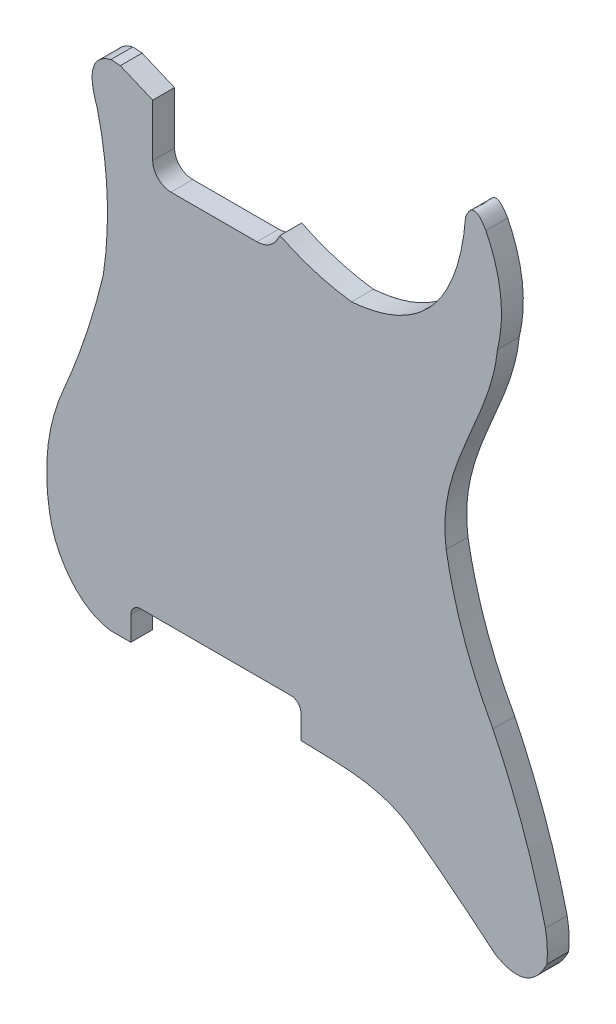
ISO-10303-21;
HEADER;
FILE_DESCRIPTION(('STEP AP214'),'2;1');
FILE_NAME('part.step','',(''),(''),'','','');
FILE_SCHEMA(('AUTOMOTIVE_DESIGN { 1 0 10303 214 1 1 1 1 }'));
ENDSEC;
DATA;
#1=APPLICATION_CONTEXT('core data for automotive mechanical design processes');
#2=APPLICATION_PROTOCOL_DEFINITION('international standard','automotive_design',2000,#1);
#3=PRODUCT_CONTEXT('',#1,'mechanical');
#4=PRODUCT('Part','Part','',(#3));
#5=PRODUCT_RELATED_PRODUCT_CATEGORY('part','',(#4));
#6=PRODUCT_DEFINITION_FORMATION('','',#4);
#7=PRODUCT_DEFINITION_CONTEXT('part definition',#1,'design');
#8=PRODUCT_DEFINITION('design','',#6,#7);
#9=PRODUCT_DEFINITION_SHAPE('','',#8);
#10=(LENGTH_UNIT() NAMED_UNIT(*) SI_UNIT(.MILLI.,.METRE.));
#11=(NAMED_UNIT(*) PLANE_ANGLE_UNIT() SI_UNIT($,.RADIAN.));
#12=(NAMED_UNIT(*) SI_UNIT($,.STERADIAN.) SOLID_ANGLE_UNIT());
#13=UNCERTAINTY_MEASURE_WITH_UNIT(LENGTH_MEASURE(1.E-05),#10,'distance_accuracy_value','');
#14=(GEOMETRIC_REPRESENTATION_CONTEXT(3) GLOBAL_UNCERTAINTY_ASSIGNED_CONTEXT((#13)) GLOBAL_UNIT_ASSIGNED_CONTEXT((#10,
#11,#12)) REPRESENTATION_CONTEXT('',''));
#15=CARTESIAN_POINT('',(0.,0.,0.));
#16=DIRECTION('',(0.,0.,1.));
#17=DIRECTION('',(1.,0.,0.));
#18=AXIS2_PLACEMENT_3D('',#15,#16,#17);
#19=CARTESIAN_POINT('',(147.862901342969,240.419802610291,10.));
#20=CARTESIAN_POINT('',(130.641476408565,242.603233813043,10.));
#21=CARTESIAN_POINT('',(115.04607442808,250.35951460855,10.));
#22=B_SPLINE_CURVE_WITH_KNOTS('',2,(#19,#20,#21),.UNSPECIFIED.,.F.,.F.,(3,3),(0.,1.),.UNSPECIFIED.);
#23=DIRECTION('',(0.,0.,-1.));
#24=VECTOR('',#23,1.);
#25=SURFACE_OF_LINEAR_EXTRUSION('',#22,#24);
#26=CARTESIAN_POINT('',(147.862901342969,240.419802610291,0.));
#27=CARTESIAN_POINT('',(130.641476408565,242.603233813043,0.));
#28=CARTESIAN_POINT('',(115.04607442808,250.35951460855,0.));
#29=B_SPLINE_CURVE_WITH_KNOTS('',2,(#26,#27,#28),.UNSPECIFIED.,.F.,.F.,(3,3),(0.,1.),.UNSPECIFIED.);
#30=CARTESIAN_POINT('',(147.862901342969,240.419802610291,0.));
#31=VERTEX_POINT('',#30);
#32=CARTESIAN_POINT('',(115.04607442808,250.35951460855,0.));
#33=VERTEX_POINT('',#32);
#34=EDGE_CURVE('E535',#31,#33,#29,.T.);
#35=ORIENTED_EDGE('',*,*,#34,.T.);
#36=DIRECTION('',(0.,0.,-1.));
#37=VECTOR('',#36,1.);
#38=CARTESIAN_POINT('',(115.04607442808,250.35951460855,10.));
#39=LINE('',#38,#37);
#40=CARTESIAN_POINT('',(115.04607442808,250.35951460855,10.));
#41=VERTEX_POINT('',#40);
#42=EDGE_CURVE('E11',#41,#33,#39,.T.);
#43=ORIENTED_EDGE('',*,*,#42,.F.);
#44=CARTESIAN_POINT('',(147.862901342969,240.419802610291,10.));
#45=VERTEX_POINT('',#44);
#46=EDGE_CURVE('E660',#45,#41,#22,.T.);
#47=ORIENTED_EDGE('',*,*,#46,.F.);
#48=DIRECTION('',(0.,0.,-1.));
#49=VECTOR('',#48,1.);
#50=CARTESIAN_POINT('',(147.862901342969,240.419802610291,10.));
#51=LINE('',#50,#49);
#52=EDGE_CURVE('E254',#45,#31,#51,.T.);
#53=ORIENTED_EDGE('',*,*,#52,.T.);
#54=EDGE_LOOP('',(#35,#43,#47,#53));
#55=FACE_BOUND('',#54,.T.);
#56=ADVANCED_FACE('F35',(#55),#25,.F.);
#57=CARTESIAN_POINT('',(115.04607442808,250.35951460855,10.));
#58=DIRECTION('',(0.875028133715148,-0.484072066129606,0.));
#59=DIRECTION('',(0.484072066129606,0.875028133715148,0.));
#60=AXIS2_PLACEMENT_3D('',#57,#58,#59);
#61=PLANE('',#60);
#62=DIRECTION('',(-0.484072066129606,-0.875028133715148,0.));
#63=VECTOR('',#62,1.);
#64=CARTESIAN_POINT('',(115.04607442808,250.35951460855,0.));
#65=LINE('',#64,#63);
#66=CARTESIAN_POINT('',(113.779669547425,248.07031021775,0.));
#67=VERTEX_POINT('',#66);
#68=EDGE_CURVE('E529',#33,#67,#65,.T.);
#69=ORIENTED_EDGE('',*,*,#68,.T.);
#70=DIRECTION('',(0.,0.,-1.));
#71=VECTOR('',#70,1.);
#72=CARTESIAN_POINT('',(113.779669547425,248.07031021775,10.));
#73=LINE('',#72,#71);
#74=CARTESIAN_POINT('',(113.779669547425,248.07031021775,10.));
#75=VERTEX_POINT('',#74);
#76=EDGE_CURVE('E44',#75,#67,#73,.T.);
#77=ORIENTED_EDGE('',*,*,#76,.F.);
#78=DIRECTION('',(-0.484072066129606,-0.875028133715148,0.));
#79=VECTOR('',#78,1.);
#80=CARTESIAN_POINT('',(115.04607442808,250.35951460855,10.));
#81=LINE('',#80,#79);
#82=EDGE_CURVE('E158',#41,#75,#81,.T.);
#83=ORIENTED_EDGE('',*,*,#82,.F.);
#84=ORIENTED_EDGE('',*,*,#42,.T.);
#85=EDGE_LOOP('',(#69,#77,#83,#84));
#86=FACE_BOUND('',#85,.T.);
#87=ADVANCED_FACE('F737',(#86),#61,.F.);
#88=CARTESIAN_POINT('',(104.457119810823,253.227614010295,10.));
#89=DIRECTION('',(0.,0.,-1.));
#90=DIRECTION('',(-1.,0.,0.));
#91=AXIS2_PLACEMENT_3D('',#88,#89,#90);
#92=CYLINDRICAL_SURFACE('',#91,10.654);
#93=CARTESIAN_POINT('',(104.457119810823,253.227614010295,0.));
#94=DIRECTION('',(0.,0.,-1.));
#95=DIRECTION('',(-1.,0.,0.));
#96=AXIS2_PLACEMENT_3D('',#93,#94,#95);
#97=CIRCLE('',#96,10.654);
#98=CARTESIAN_POINT('',(104.457119810823,242.573614010295,0.));
#99=VERTEX_POINT('',#98);
#100=EDGE_CURVE('E523',#67,#99,#97,.T.);
#101=ORIENTED_EDGE('',*,*,#100,.T.);
#102=DIRECTION('',(0.,0.,-1.));
#103=VECTOR('',#102,1.);
#104=CARTESIAN_POINT('',(104.457119810823,242.573614010295,10.));
#105=LINE('',#104,#103);
#106=CARTESIAN_POINT('',(104.457119810823,242.573614010295,10.));
#107=VERTEX_POINT('',#106);
#108=EDGE_CURVE('E515',#107,#99,#105,.T.);
#109=ORIENTED_EDGE('',*,*,#108,.F.);
#110=CARTESIAN_POINT('',(104.457119810823,253.227614010295,10.));
#111=DIRECTION('',(0.,0.,-1.));
#112=DIRECTION('',(-1.,0.,0.));
#113=AXIS2_PLACEMENT_3D('',#110,#111,#112);
#114=CIRCLE('',#113,10.654);
#115=EDGE_CURVE('E524',#75,#107,#114,.T.);
#116=ORIENTED_EDGE('',*,*,#115,.F.);
#117=ORIENTED_EDGE('',*,*,#76,.T.);
#118=EDGE_LOOP('',(#101,#109,#116,#117));
#119=FACE_BOUND('',#118,.T.);
#120=ADVANCED_FACE('F521',(#119),#92,.F.);
#121=CARTESIAN_POINT('',(104.457119810823,242.573614010295,10.));
#122=DIRECTION('',(0.,-1.,0.));
#123=DIRECTION('',(0.,0.,-1.));
#124=AXIS2_PLACEMENT_3D('',#121,#122,#123);
#125=PLANE('',#124);
#126=DIRECTION('',(-1.,0.,0.));
#127=VECTOR('',#126,1.);
#128=CARTESIAN_POINT('',(104.457119810823,242.573614010295,0.));
#129=LINE('',#128,#127);
#130=CARTESIAN_POINT('',(65.0492117527098,242.573614010295,0.));
#131=VERTEX_POINT('',#130);
#132=EDGE_CURVE('E531',#99,#131,#129,.T.);
#133=ORIENTED_EDGE('',*,*,#132,.T.);
#134=DIRECTION('',(0.,0.,-1.));
#135=VECTOR('',#134,1.);
#136=CARTESIAN_POINT('',(65.0492117527098,242.573614010295,10.));
#137=LINE('',#136,#135);
#138=CARTESIAN_POINT('',(65.0492117527098,242.573614010295,10.));
#139=VERTEX_POINT('',#138);
#140=EDGE_CURVE('E512',#139,#131,#137,.T.);
#141=ORIENTED_EDGE('',*,*,#140,.F.);
#142=DIRECTION('',(-1.,0.,0.));
#143=VECTOR('',#142,1.);
#144=CARTESIAN_POINT('',(104.457119810823,242.573614010295,10.));
#145=LINE('',#144,#143);
#146=EDGE_CURVE('E682',#107,#139,#145,.T.);
#147=ORIENTED_EDGE('',*,*,#146,.F.);
#148=ORIENTED_EDGE('',*,*,#108,.T.);
#149=EDGE_LOOP('',(#133,#141,#147,#148));
#150=FACE_BOUND('',#149,.T.);
#151=ADVANCED_FACE('F731',(#150),#125,.F.);
#152=CARTESIAN_POINT('',(65.0492117527098,250.944614010295,10.));
#153=DIRECTION('',(0.,0.,-1.));
#154=DIRECTION('',(-1.,0.,0.));
#155=AXIS2_PLACEMENT_3D('',#152,#153,#154);
#156=CYLINDRICAL_SURFACE('',#155,8.37100000000001);
#157=CARTESIAN_POINT('',(65.0492117527098,250.944614010295,0.));
#158=DIRECTION('',(0.,0.,-1.));
#159=DIRECTION('',(-1.,0.,0.));
#160=AXIS2_PLACEMENT_3D('',#157,#158,#159);
#161=CIRCLE('',#160,8.37100000000001);
#162=CARTESIAN_POINT('',(56.6782117527098,250.944614010295,0.));
#163=VERTEX_POINT('',#162);
#164=EDGE_CURVE('E533',#131,#163,#161,.T.);
#165=ORIENTED_EDGE('',*,*,#164,.T.);
#166=DIRECTION('',(0.,0.,-1.));
#167=VECTOR('',#166,1.);
#168=CARTESIAN_POINT('',(56.6782117527098,250.944614010295,10.));
#169=LINE('',#168,#167);
#170=CARTESIAN_POINT('',(56.6782117527098,250.944614010295,10.));
#171=VERTEX_POINT('',#170);
#172=EDGE_CURVE('E509',#171,#163,#169,.T.);
#173=ORIENTED_EDGE('',*,*,#172,.F.);
#174=CARTESIAN_POINT('',(65.0492117527098,250.944614010295,10.));
#175=DIRECTION('',(0.,0.,-1.));
#176=DIRECTION('',(-1.,0.,0.));
#177=AXIS2_PLACEMENT_3D('',#174,#175,#176);
#178=CIRCLE('',#177,8.37100000000001);
#179=EDGE_CURVE('E684',#139,#171,#178,.T.);
#180=ORIENTED_EDGE('',*,*,#179,.F.);
#181=ORIENTED_EDGE('',*,*,#140,.T.);
#182=EDGE_LOOP('',(#165,#173,#180,#181));
#183=FACE_BOUND('',#182,.T.);
#184=ADVANCED_FACE('F727',(#183),#156,.F.);
#185=CARTESIAN_POINT('',(56.6782117527098,250.944614010295,10.));
#186=DIRECTION('',(-1.,0.,0.));
#187=DIRECTION('',(0.,0.,1.));
#188=AXIS2_PLACEMENT_3D('',#185,#186,#187);
#189=PLANE('',#188);
#190=DIRECTION('',(0.,1.,0.));
#191=VECTOR('',#190,1.);
#192=CARTESIAN_POINT('',(56.6782117527098,250.944614010295,0.));
#193=LINE('',#192,#191);
#194=CARTESIAN_POINT('',(56.6782117527098,274.911461444318,0.));
#195=VERTEX_POINT('',#194);
#196=EDGE_CURVE('E539',#163,#195,#193,.T.);
#197=ORIENTED_EDGE('',*,*,#196,.T.);
#198=DIRECTION('',(0.,0.,-1.));
#199=VECTOR('',#198,1.);
#200=CARTESIAN_POINT('',(56.6782117527098,274.911461444318,10.));
#201=LINE('',#200,#199);
#202=CARTESIAN_POINT('',(56.6782117527098,274.911461444318,10.));
#203=VERTEX_POINT('',#202);
#204=EDGE_CURVE('E506',#203,#195,#201,.T.);
#205=ORIENTED_EDGE('',*,*,#204,.F.);
#206=DIRECTION('',(0.,1.,0.));
#207=VECTOR('',#206,1.);
#208=CARTESIAN_POINT('',(56.6782117527098,250.944614010295,10.));
#209=LINE('',#208,#207);
#210=EDGE_CURVE('E686',#171,#203,#209,.T.);
#211=ORIENTED_EDGE('',*,*,#210,.F.);
#212=ORIENTED_EDGE('',*,*,#172,.T.);
#213=EDGE_LOOP('',(#197,#205,#211,#212));
#214=FACE_BOUND('',#213,.T.);
#215=ADVANCED_FACE('F723',(#214),#189,.F.);
#216=CARTESIAN_POINT('',(41.820716746413,281.182482063858,10.));
#217=DIRECTION('',(-0.388859205028852,-0.921297193452975,0.));
#218=DIRECTION('',(0.921297193452975,-0.388859205028852,0.));
#219=AXIS2_PLACEMENT_3D('',#216,#217,#218);
#220=PLANE('',#219);
#221=DIRECTION('',(-0.921297193452975,0.388859205028852,0.));
#222=VECTOR('',#221,1.);
#223=CARTESIAN_POINT('',(41.820716746413,281.182482063858,0.));
#224=LINE('',#223,#222);
#225=CARTESIAN_POINT('',(41.820716746413,281.182482063858,0.));
#226=VERTEX_POINT('',#225);
#227=EDGE_CURVE('E541',#195,#226,#224,.T.);
#228=ORIENTED_EDGE('',*,*,#227,.T.);
#229=DIRECTION('',(0.,0.,-1.));
#230=VECTOR('',#229,1.);
#231=CARTESIAN_POINT('',(41.820716746413,281.182482063858,10.));
#232=LINE('',#231,#230);
#233=CARTESIAN_POINT('',(41.820716746413,281.182482063858,10.));
#234=VERTEX_POINT('',#233);
#235=EDGE_CURVE('E503',#234,#226,#232,.T.);
#236=ORIENTED_EDGE('',*,*,#235,.F.);
#237=DIRECTION('',(-0.921297193452975,0.388859205028852,0.));
#238=VECTOR('',#237,1.);
#239=CARTESIAN_POINT('',(41.820716746413,281.182482063858,10.));
#240=LINE('',#239,#238);
#241=EDGE_CURVE('E688',#203,#234,#240,.T.);
#242=ORIENTED_EDGE('',*,*,#241,.F.);
#243=ORIENTED_EDGE('',*,*,#204,.T.);
#244=EDGE_LOOP('',(#228,#236,#242,#243));
#245=FACE_BOUND('',#244,.T.);
#246=ADVANCED_FACE('F719',(#245),#220,.F.);
#247=CARTESIAN_POINT('',(41.820716746413,281.182482063858,10.));
#248=DIRECTION('',(-0.0695594595046964,-0.99757780728794,0.));
#249=DIRECTION('',(0.99757780728794,-0.0695594595046964,0.));
#250=AXIS2_PLACEMENT_3D('',#247,#248,#249);
#251=PLANE('',#250);
#252=CARTESIAN_POINT('',(41.820716746413,281.182482063858,0.));
#253=CARTESIAN_POINT('',(37.5222886454544,281.482204384502,0.));
#254=B_SPLINE_CURVE_WITH_KNOTS('',1,(#252,#253),.UNSPECIFIED.,.F.,.F.,(2,2),(0.,1.),.UNSPECIFIED.);
#255=CARTESIAN_POINT('',(37.5222886454544,281.482204384502,0.));
#256=VERTEX_POINT('',#255);
#257=EDGE_CURVE('E543',#226,#256,#254,.T.);
#258=ORIENTED_EDGE('',*,*,#257,.T.);
#259=DIRECTION('',(0.,0.,-1.));
#260=VECTOR('',#259,1.);
#261=CARTESIAN_POINT('',(37.5222886454544,281.482204384502,10.));
#262=LINE('',#261,#260);
#263=CARTESIAN_POINT('',(37.5222886454544,281.482204384502,10.));
#264=VERTEX_POINT('',#263);
#265=EDGE_CURVE('E500',#264,#256,#262,.T.);
#266=ORIENTED_EDGE('',*,*,#265,.F.);
#267=CARTESIAN_POINT('',(41.820716746413,281.182482063858,10.));
#268=CARTESIAN_POINT('',(37.5222886454544,281.482204384502,10.));
#269=B_SPLINE_CURVE_WITH_KNOTS('',1,(#267,#268),.UNSPECIFIED.,.F.,.F.,(2,2),(0.,1.),.UNSPECIFIED.);
#270=EDGE_CURVE('E690',#234,#264,#269,.T.);
#271=ORIENTED_EDGE('',*,*,#270,.F.);
#272=ORIENTED_EDGE('',*,*,#235,.T.);
#273=EDGE_LOOP('',(#258,#266,#271,#272));
#274=FACE_BOUND('',#273,.T.);
#275=ADVANCED_FACE('F715',(#274),#251,.F.);
#276=CARTESIAN_POINT('',(37.5222886454544,281.482204384502,10.));
#277=CARTESIAN_POINT('',(24.3422404723728,277.969027168823,10.));
#278=CARTESIAN_POINT('',(31.2957161286418,258.863919401523,10.));
#279=B_SPLINE_CURVE_WITH_KNOTS('',2,(#276,#277,#278),.UNSPECIFIED.,.F.,.F.,(3,3),(0.,1.),.UNSPECIFIED.);
#280=DIRECTION('',(0.,0.,-1.));
#281=VECTOR('',#280,1.);
#282=SURFACE_OF_LINEAR_EXTRUSION('',#279,#281);
#283=CARTESIAN_POINT('',(37.5222886454544,281.482204384502,0.));
#284=CARTESIAN_POINT('',(24.3422404723728,277.969027168823,0.));
#285=CARTESIAN_POINT('',(31.2957161286418,258.863919401523,0.));
#286=B_SPLINE_CURVE_WITH_KNOTS('',2,(#283,#284,#285),.UNSPECIFIED.,.F.,.F.,(3,3),(0.,1.),.UNSPECIFIED.);
#287=CARTESIAN_POINT('',(31.2957161286418,258.863919401523,0.));
#288=VERTEX_POINT('',#287);
#289=EDGE_CURVE('E547',#256,#288,#286,.T.);
#290=ORIENTED_EDGE('',*,*,#289,.T.);
#291=DIRECTION('',(0.,0.,-1.));
#292=VECTOR('',#291,1.);
#293=CARTESIAN_POINT('',(31.2957161286418,258.863919401523,10.));
#294=LINE('',#293,#292);
#295=CARTESIAN_POINT('',(31.2957161286418,258.863919401523,10.));
#296=VERTEX_POINT('',#295);
#297=EDGE_CURVE('E497',#296,#288,#294,.T.);
#298=ORIENTED_EDGE('',*,*,#297,.F.);
#299=EDGE_CURVE('E694',#264,#296,#279,.T.);
#300=ORIENTED_EDGE('',*,*,#299,.F.);
#301=ORIENTED_EDGE('',*,*,#265,.T.);
#302=EDGE_LOOP('',(#290,#298,#300,#301));
#303=FACE_BOUND('',#302,.T.);
#304=ADVANCED_FACE('F710',(#303),#282,.F.);
#305=CARTESIAN_POINT('',(31.2957161286418,258.863919401523,10.));
#306=CARTESIAN_POINT('',(38.9227696680825,226.832256951286,10.));
#307=CARTESIAN_POINT('',(34.0318252997754,194.214132046659,10.));
#308=B_SPLINE_CURVE_WITH_KNOTS('',2,(#305,#306,#307),.UNSPECIFIED.,.F.,.F.,(3,3),(0.,1.),.UNSPECIFIED.);
#309=DIRECTION('',(0.,0.,-1.));
#310=VECTOR('',#309,1.);
#311=SURFACE_OF_LINEAR_EXTRUSION('',#308,#310);
#312=CARTESIAN_POINT('',(31.2957161286418,258.863919401523,0.));
#313=CARTESIAN_POINT('',(38.9227696680825,226.832256951286,0.));
#314=CARTESIAN_POINT('',(34.0318252997754,194.214132046659,0.));
#315=B_SPLINE_CURVE_WITH_KNOTS('',2,(#312,#313,#314),.UNSPECIFIED.,.F.,.F.,(3,3),(0.,1.),.UNSPECIFIED.);
#316=CARTESIAN_POINT('',(34.0318252997754,194.214132046659,0.));
#317=VERTEX_POINT('',#316);
#318=EDGE_CURVE('E554',#288,#317,#315,.T.);
#319=ORIENTED_EDGE('',*,*,#318,.T.);
#320=DIRECTION('',(0.,0.,-1.));
#321=VECTOR('',#320,1.);
#322=CARTESIAN_POINT('',(34.0318252997754,194.214132046659,10.));
#323=LINE('',#322,#321);
#324=CARTESIAN_POINT('',(34.0318252997754,194.214132046659,10.));
#325=VERTEX_POINT('',#324);
#326=EDGE_CURVE('E494',#325,#317,#323,.T.);
#327=ORIENTED_EDGE('',*,*,#326,.F.);
#328=EDGE_CURVE('E702',#296,#325,#308,.T.);
#329=ORIENTED_EDGE('',*,*,#328,.F.);
#330=ORIENTED_EDGE('',*,*,#297,.T.);
#331=EDGE_LOOP('',(#319,#327,#329,#330));
#332=FACE_BOUND('',#331,.T.);
#333=ADVANCED_FACE('F714',(#332),#311,.F.);
#334=CARTESIAN_POINT('',(34.0318252997754,194.214132046659,10.));
#335=CARTESIAN_POINT('',(27.4058724788899,166.530361958209,10.));
#336=CARTESIAN_POINT('',(16.1488171778375,140.412638244984,10.));
#337=B_SPLINE_CURVE_WITH_KNOTS('',2,(#334,#335,#336),.UNSPECIFIED.,.F.,.F.,(3,3),(0.,1.),.UNSPECIFIED.);
#338=DIRECTION('',(0.,0.,-1.));
#339=VECTOR('',#338,1.);
#340=SURFACE_OF_LINEAR_EXTRUSION('',#337,#339);
#341=CARTESIAN_POINT('',(34.0318252997754,194.214132046659,0.));
#342=CARTESIAN_POINT('',(27.4058724788899,166.530361958209,0.));
#343=CARTESIAN_POINT('',(16.1488171778375,140.412638244984,0.));
#344=B_SPLINE_CURVE_WITH_KNOTS('',2,(#341,#342,#343),.UNSPECIFIED.,.F.,.F.,(3,3),(0.,1.),.UNSPECIFIED.);
#345=CARTESIAN_POINT('',(16.1488171778375,140.412638244984,0.));
#346=VERTEX_POINT('',#345);
#347=EDGE_CURVE('E561',#317,#346,#344,.T.);
#348=ORIENTED_EDGE('',*,*,#347,.T.);
#349=DIRECTION('',(0.,0.,-1.));
#350=VECTOR('',#349,1.);
#351=CARTESIAN_POINT('',(16.1488171778375,140.412638244984,10.));
#352=LINE('',#351,#350);
#353=CARTESIAN_POINT('',(16.1488171778375,140.412638244984,10.));
#354=VERTEX_POINT('',#353);
#355=EDGE_CURVE('E491',#354,#346,#352,.T.);
#356=ORIENTED_EDGE('',*,*,#355,.F.);
#357=EDGE_CURVE('E957',#325,#354,#337,.T.);
#358=ORIENTED_EDGE('',*,*,#357,.F.);
#359=ORIENTED_EDGE('',*,*,#326,.T.);
#360=EDGE_LOOP('',(#348,#356,#358,#359));
#361=FACE_BOUND('',#360,.T.);
#362=ADVANCED_FACE('F799',(#361),#340,.F.);
#363=CARTESIAN_POINT('',(16.1488171778375,140.412638244984,10.));
#364=CARTESIAN_POINT('',(4.81688502392703,115.123208654069,10.));
#365=CARTESIAN_POINT('',(9.33316098104835,87.8515704351189,10.));
#366=B_SPLINE_CURVE_WITH_KNOTS('',2,(#363,#364,#365),.UNSPECIFIED.,.F.,.F.,(3,3),(0.,1.),.UNSPECIFIED.);
#367=DIRECTION('',(0.,0.,-1.));
#368=VECTOR('',#367,1.);
#369=SURFACE_OF_LINEAR_EXTRUSION('',#366,#368);
#370=CARTESIAN_POINT('',(16.1488171778375,140.412638244984,0.));
#371=CARTESIAN_POINT('',(4.81688502392703,115.123208654069,0.));
#372=CARTESIAN_POINT('',(9.33316098104835,87.8515704351189,0.));
#373=B_SPLINE_CURVE_WITH_KNOTS('',2,(#370,#371,#372),.UNSPECIFIED.,.F.,.F.,(3,3),(0.,1.),.UNSPECIFIED.);
#374=CARTESIAN_POINT('',(9.33316098104835,87.8515704351189,0.));
#375=VERTEX_POINT('',#374);
#376=EDGE_CURVE('E568',#346,#375,#373,.T.);
#377=ORIENTED_EDGE('',*,*,#376,.T.);
#378=DIRECTION('',(0.,0.,-1.));
#379=VECTOR('',#378,1.);
#380=CARTESIAN_POINT('',(9.33316098104835,87.8515704351189,10.));
#381=LINE('',#380,#379);
#382=CARTESIAN_POINT('',(9.33316098104835,87.8515704351189,10.));
#383=VERTEX_POINT('',#382);
#384=EDGE_CURVE('E488',#383,#375,#381,.T.);
#385=ORIENTED_EDGE('',*,*,#384,.F.);
#386=EDGE_CURVE('E394',#354,#383,#366,.T.);
#387=ORIENTED_EDGE('',*,*,#386,.F.);
#388=ORIENTED_EDGE('',*,*,#355,.T.);
#389=EDGE_LOOP('',(#377,#385,#387,#388));
#390=FACE_BOUND('',#389,.T.);
#391=ADVANCED_FACE('F384',(#390),#369,.F.);
#392=CARTESIAN_POINT('',(9.33316098104835,87.8515704351189,10.));
#393=CARTESIAN_POINT('',(11.2931689459671,73.6724464705947,10.));
#394=CARTESIAN_POINT('',(21.9595146444395,56.5133766101038,10.));
#395=CARTESIAN_POINT('',(37.5222886454544,54.5795588251683,10.));
#396=B_SPLINE_CURVE_WITH_KNOTS('',3,(#392,#393,#394,#395),.UNSPECIFIED.,.F.,.F.,(4,4),(0.,1.),.UNSPECIFIED.);
#397=DIRECTION('',(0.,0.,-1.));
#398=VECTOR('',#397,1.);
#399=SURFACE_OF_LINEAR_EXTRUSION('',#396,#398);
#400=CARTESIAN_POINT('',(9.33316098104835,87.8515704351189,0.));
#401=CARTESIAN_POINT('',(11.2931689459671,73.6724464705947,0.));
#402=CARTESIAN_POINT('',(21.9595146444395,56.5133766101038,0.));
#403=CARTESIAN_POINT('',(37.5222886454544,54.5795588251683,0.));
#404=B_SPLINE_CURVE_WITH_KNOTS('',3,(#400,#401,#402,#403),.UNSPECIFIED.,.F.,.F.,(4,4),(0.,1.),.UNSPECIFIED.);
#405=CARTESIAN_POINT('',(37.5222886454544,54.5795588251683,0.));
#406=VERTEX_POINT('',#405);
#407=EDGE_CURVE('E575',#375,#406,#404,.T.);
#408=ORIENTED_EDGE('',*,*,#407,.T.);
#409=DIRECTION('',(0.,0.,-1.));
#410=VECTOR('',#409,1.);
#411=CARTESIAN_POINT('',(37.5222886454544,54.5795588251683,10.));
#412=LINE('',#411,#410);
#413=CARTESIAN_POINT('',(37.5222886454544,54.5795588251683,10.));
#414=VERTEX_POINT('',#413);
#415=EDGE_CURVE('E485',#414,#406,#412,.T.);
#416=ORIENTED_EDGE('',*,*,#415,.F.);
#417=EDGE_CURVE('E388',#383,#414,#396,.T.);
#418=ORIENTED_EDGE('',*,*,#417,.F.);
#419=ORIENTED_EDGE('',*,*,#384,.T.);
#420=EDGE_LOOP('',(#408,#416,#418,#419));
#421=FACE_BOUND('',#420,.T.);
#422=ADVANCED_FACE('F379',(#421),#399,.F.);
#423=CARTESIAN_POINT('',(37.5222886454544,54.5795588251683,10.));
#424=DIRECTION('',(0.,1.,0.));
#425=DIRECTION('',(0.,0.,1.));
#426=AXIS2_PLACEMENT_3D('',#423,#424,#425);
#427=PLANE('',#426);
#428=CARTESIAN_POINT('',(37.5222886454544,54.5795588251683,0.));
#429=CARTESIAN_POINT('',(46.6463901073785,54.5795588251683,0.));
#430=B_SPLINE_CURVE_WITH_KNOTS('',1,(#428,#429),.UNSPECIFIED.,.F.,.F.,(2,2),(0.,1.),.UNSPECIFIED.);
#431=CARTESIAN_POINT('',(46.6463901073785,54.5795588251683,0.));
#432=VERTEX_POINT('',#431);
#433=EDGE_CURVE('E582',#406,#432,#430,.T.);
#434=ORIENTED_EDGE('',*,*,#433,.T.);
#435=DIRECTION('',(0.,0.,-1.));
#436=VECTOR('',#435,1.);
#437=CARTESIAN_POINT('',(46.6463901073785,54.5795588251683,10.));
#438=LINE('',#437,#436);
#439=CARTESIAN_POINT('',(46.6463901073785,54.5795588251683,10.));
#440=VERTEX_POINT('',#439);
#441=EDGE_CURVE('E482',#440,#432,#438,.T.);
#442=ORIENTED_EDGE('',*,*,#441,.F.);
#443=CARTESIAN_POINT('',(37.5222886454544,54.5795588251683,10.));
#444=CARTESIAN_POINT('',(46.6463901073785,54.5795588251683,10.));
#445=B_SPLINE_CURVE_WITH_KNOTS('',1,(#443,#444),.UNSPECIFIED.,.F.,.F.,(2,2),(0.,1.),.UNSPECIFIED.);
#446=EDGE_CURVE('E393',#414,#440,#445,.T.);
#447=ORIENTED_EDGE('',*,*,#446,.F.);
#448=ORIENTED_EDGE('',*,*,#415,.T.);
#449=EDGE_LOOP('',(#434,#442,#447,#448));
#450=FACE_BOUND('',#449,.T.);
#451=ADVANCED_FACE('F375',(#450),#427,.F.);
#452=CARTESIAN_POINT('',(46.6463901073785,65.5766545287712,10.));
#453=DIRECTION('',(-1.,0.,0.));
#454=DIRECTION('',(0.,0.,1.));
#455=AXIS2_PLACEMENT_3D('',#452,#453,#454);
#456=PLANE('',#455);
#457=DIRECTION('',(0.,1.,0.));
#458=VECTOR('',#457,1.);
#459=CARTESIAN_POINT('',(46.6463901073785,65.5766545287712,0.));
#460=LINE('',#459,#458);
#461=CARTESIAN_POINT('',(46.6463901073785,65.5766545287712,0.));
#462=VERTEX_POINT('',#461);
#463=EDGE_CURVE('E589',#432,#462,#460,.T.);
#464=ORIENTED_EDGE('',*,*,#463,.T.);
#465=DIRECTION('',(0.,0.,-1.));
#466=VECTOR('',#465,1.);
#467=CARTESIAN_POINT('',(46.6463901073785,65.5766545287712,10.));
#468=LINE('',#467,#466);
#469=CARTESIAN_POINT('',(46.6463901073785,65.5766545287712,10.));
#470=VERTEX_POINT('',#469);
#471=EDGE_CURVE('E479',#470,#462,#468,.T.);
#472=ORIENTED_EDGE('',*,*,#471,.F.);
#473=DIRECTION('',(0.,1.,0.));
#474=VECTOR('',#473,1.);
#475=CARTESIAN_POINT('',(46.6463901073785,65.5766545287712,10.));
#476=LINE('',#475,#474);
#477=EDGE_CURVE('E405',#440,#470,#476,.T.);
#478=ORIENTED_EDGE('',*,*,#477,.F.);
#479=ORIENTED_EDGE('',*,*,#441,.T.);
#480=EDGE_LOOP('',(#464,#472,#478,#479));
#481=FACE_BOUND('',#480,.T.);
#482=ADVANCED_FACE('F371',(#481),#456,.F.);
#483=CARTESIAN_POINT('',(51.2123901073785,65.5766545287713,10.));
#484=DIRECTION('',(0.,0.,-1.));
#485=DIRECTION('',(-1.,0.,0.));
#486=AXIS2_PLACEMENT_3D('',#483,#484,#485);
#487=CYLINDRICAL_SURFACE('',#486,4.566);
#488=CARTESIAN_POINT('',(51.2123901073785,65.5766545287713,0.));
#489=DIRECTION('',(0.,0.,-1.));
#490=DIRECTION('',(1.,0.,0.));
#491=AXIS2_PLACEMENT_3D('',#488,#489,#490);
#492=CIRCLE('',#491,4.566);
#493=CARTESIAN_POINT('',(51.2123901073786,70.1426545287713,0.));
#494=VERTEX_POINT('',#493);
#495=EDGE_CURVE('E594',#462,#494,#492,.T.);
#496=ORIENTED_EDGE('',*,*,#495,.T.);
#497=DIRECTION('',(0.,0.,-1.));
#498=VECTOR('',#497,1.);
#499=CARTESIAN_POINT('',(51.2123901073786,70.1426545287713,10.));
#500=LINE('',#499,#498);
#501=CARTESIAN_POINT('',(51.2123901073786,70.1426545287713,10.));
#502=VERTEX_POINT('',#501);
#503=EDGE_CURVE('E476',#502,#494,#500,.T.);
#504=ORIENTED_EDGE('',*,*,#503,.F.);
#505=CARTESIAN_POINT('',(51.2123901073785,65.5766545287713,10.));
#506=DIRECTION('',(0.,0.,-1.));
#507=DIRECTION('',(1.,0.,0.));
#508=AXIS2_PLACEMENT_3D('',#505,#506,#507);
#509=CIRCLE('',#508,4.566);
#510=EDGE_CURVE('E410',#470,#502,#509,.T.);
#511=ORIENTED_EDGE('',*,*,#510,.F.);
#512=ORIENTED_EDGE('',*,*,#471,.T.);
#513=EDGE_LOOP('',(#496,#504,#511,#512));
#514=FACE_BOUND('',#513,.T.);
#515=ADVANCED_FACE('F367',(#514),#487,.F.);
#516=CARTESIAN_POINT('',(120.07534121064,70.1426545287713,10.));
#517=DIRECTION('',(0.,1.,0.));
#518=DIRECTION('',(0.,0.,1.));
#519=AXIS2_PLACEMENT_3D('',#516,#517,#518);
#520=PLANE('',#519);
#521=DIRECTION('',(1.,0.,0.));
#522=VECTOR('',#521,1.);
#523=CARTESIAN_POINT('',(120.07534121064,70.1426545287713,0.));
#524=LINE('',#523,#522);
#525=CARTESIAN_POINT('',(120.07534121064,70.1426545287713,0.));
#526=VERTEX_POINT('',#525);
#527=EDGE_CURVE('E596',#494,#526,#524,.T.);
#528=ORIENTED_EDGE('',*,*,#527,.T.);
#529=DIRECTION('',(0.,0.,-1.));
#530=VECTOR('',#529,1.);
#531=CARTESIAN_POINT('',(120.07534121064,70.1426545287713,10.));
#532=LINE('',#531,#530);
#533=CARTESIAN_POINT('',(120.07534121064,70.1426545287713,10.));
#534=VERTEX_POINT('',#533);
#535=EDGE_CURVE('E473',#534,#526,#532,.T.);
#536=ORIENTED_EDGE('',*,*,#535,.F.);
#537=DIRECTION('',(1.,0.,0.));
#538=VECTOR('',#537,1.);
#539=CARTESIAN_POINT('',(120.07534121064,70.1426545287713,10.));
#540=LINE('',#539,#538);
#541=EDGE_CURVE('E412',#502,#534,#540,.T.);
#542=ORIENTED_EDGE('',*,*,#541,.F.);
#543=ORIENTED_EDGE('',*,*,#503,.T.);
#544=EDGE_LOOP('',(#528,#536,#542,#543));
#545=FACE_BOUND('',#544,.T.);
#546=ADVANCED_FACE('F363',(#545),#520,.F.);
#547=CARTESIAN_POINT('',(120.07534121064,65.5766545287713,10.));
#548=DIRECTION('',(0.,0.,-1.));
#549=DIRECTION('',(-1.,0.,0.));
#550=AXIS2_PLACEMENT_3D('',#547,#548,#549);
#551=CYLINDRICAL_SURFACE('',#550,4.566);
#552=CARTESIAN_POINT('',(120.07534121064,65.5766545287713,0.));
#553=DIRECTION('',(0.,0.,-1.));
#554=DIRECTION('',(1.,0.,0.));
#555=AXIS2_PLACEMENT_3D('',#552,#553,#554);
#556=CIRCLE('',#555,4.566);
#557=CARTESIAN_POINT('',(124.64134121064,65.5766545287712,0.));
#558=VERTEX_POINT('',#557);
#559=EDGE_CURVE('E598',#526,#558,#556,.T.);
#560=ORIENTED_EDGE('',*,*,#559,.T.);
#561=DIRECTION('',(0.,0.,-1.));
#562=VECTOR('',#561,1.);
#563=CARTESIAN_POINT('',(124.64134121064,65.5766545287712,10.));
#564=LINE('',#563,#562);
#565=CARTESIAN_POINT('',(124.64134121064,65.5766545287712,10.));
#566=VERTEX_POINT('',#565);
#567=EDGE_CURVE('E426',#566,#558,#564,.T.);
#568=ORIENTED_EDGE('',*,*,#567,.F.);
#569=CARTESIAN_POINT('',(120.07534121064,65.5766545287713,10.));
#570=DIRECTION('',(0.,0.,-1.));
#571=DIRECTION('',(1.,0.,0.));
#572=AXIS2_PLACEMENT_3D('',#569,#570,#571);
#573=CIRCLE('',#572,4.566);
#574=EDGE_CURVE('E413',#534,#566,#573,.T.);
#575=ORIENTED_EDGE('',*,*,#574,.F.);
#576=ORIENTED_EDGE('',*,*,#535,.T.);
#577=EDGE_LOOP('',(#560,#568,#575,#576));
#578=FACE_BOUND('',#577,.T.);
#579=ADVANCED_FACE('F359',(#578),#551,.F.);
#580=CARTESIAN_POINT('',(124.64134121064,54.5795588251683,10.));
#581=DIRECTION('',(1.,0.,0.));
#582=DIRECTION('',(0.,0.,-1.));
#583=AXIS2_PLACEMENT_3D('',#580,#581,#582);
#584=PLANE('',#583);
#585=DIRECTION('',(0.,-1.,0.));
#586=VECTOR('',#585,1.);
#587=CARTESIAN_POINT('',(124.64134121064,54.5795588251683,0.));
#588=LINE('',#587,#586);
#589=CARTESIAN_POINT('',(124.64134121064,54.5795588251683,0.));
#590=VERTEX_POINT('',#589);
#591=EDGE_CURVE('E424',#558,#590,#588,.T.);
#592=ORIENTED_EDGE('',*,*,#591,.T.);
#593=DIRECTION('',(0.,0.,-1.));
#594=VECTOR('',#593,1.);
#595=CARTESIAN_POINT('',(124.64134121064,54.5795588251683,10.));
#596=LINE('',#595,#594);
#597=CARTESIAN_POINT('',(124.64134121064,54.5795588251683,10.));
#598=VERTEX_POINT('',#597);
#599=EDGE_CURVE('E422',#598,#590,#596,.T.);
#600=ORIENTED_EDGE('',*,*,#599,.F.);
#601=DIRECTION('',(0.,-1.,0.));
#602=VECTOR('',#601,1.);
#603=CARTESIAN_POINT('',(124.64134121064,54.5795588251683,10.));
#604=LINE('',#603,#602);
#605=EDGE_CURVE('E347',#566,#598,#604,.T.);
#606=ORIENTED_EDGE('',*,*,#605,.F.);
#607=ORIENTED_EDGE('',*,*,#567,.T.);
#608=EDGE_LOOP('',(#592,#600,#606,#607));
#609=FACE_BOUND('',#608,.T.);
#610=ADVANCED_FACE('F355',(#609),#584,.F.);
#611=CARTESIAN_POINT('',(124.64134121064,54.5795588251683,10.));
#612=CARTESIAN_POINT('',(141.198769972361,53.9222444862959,10.));
#613=CARTESIAN_POINT('',(159.806078551079,55.0780700205448,10.));
#614=CARTESIAN_POINT('',(174.369459856295,45.394945882699,10.));
#615=B_SPLINE_CURVE_WITH_KNOTS('',3,(#611,#612,#613,#614),.UNSPECIFIED.,.F.,.F.,(4,4),(0.,1.),.UNSPECIFIED.);
#616=DIRECTION('',(0.,0.,-1.));
#617=VECTOR('',#616,1.);
#618=SURFACE_OF_LINEAR_EXTRUSION('',#615,#617);
#619=CARTESIAN_POINT('',(124.64134121064,54.5795588251683,0.));
#620=CARTESIAN_POINT('',(141.198769972361,53.9222444862959,0.));
#621=CARTESIAN_POINT('',(159.806078551079,55.0780700205448,0.));
#622=CARTESIAN_POINT('',(174.369459856295,45.394945882699,0.));
#623=B_SPLINE_CURVE_WITH_KNOTS('',3,(#619,#620,#621,#622),.UNSPECIFIED.,.F.,.F.,(4,4),(0.,1.),.UNSPECIFIED.);
#624=CARTESIAN_POINT('',(174.369459856295,45.394945882699,0.));
#625=VERTEX_POINT('',#624);
#626=EDGE_CURVE('E431',#590,#625,#623,.T.);
#627=ORIENTED_EDGE('',*,*,#626,.T.);
#628=DIRECTION('',(0.,0.,-1.));
#629=VECTOR('',#628,1.);
#630=CARTESIAN_POINT('',(174.369459856295,45.394945882699,10.));
#631=LINE('',#630,#629);
#632=CARTESIAN_POINT('',(174.369459856295,45.394945882699,10.));
#633=VERTEX_POINT('',#632);
#634=EDGE_CURVE('E427',#633,#625,#631,.T.);
#635=ORIENTED_EDGE('',*,*,#634,.F.);
#636=EDGE_CURVE('E339',#598,#633,#615,.T.);
#637=ORIENTED_EDGE('',*,*,#636,.F.);
#638=ORIENTED_EDGE('',*,*,#599,.T.);
#639=EDGE_LOOP('',(#627,#635,#637,#638));
#640=FACE_BOUND('',#639,.T.);
#641=ADVANCED_FACE('F352',(#640),#618,.F.);
#642=CARTESIAN_POINT('',(174.369459856295,45.394945882699,10.));
#643=CARTESIAN_POINT('',(194.666199965115,30.3344324757174,10.));
#644=CARTESIAN_POINT('',(213.990313768759,14.041488397477,10.));
#645=B_SPLINE_CURVE_WITH_KNOTS('',2,(#642,#643,#644),.UNSPECIFIED.,.F.,.F.,(3,3),(0.,1.),.UNSPECIFIED.);
#646=DIRECTION('',(0.,0.,-1.));
#647=VECTOR('',#646,1.);
#648=SURFACE_OF_LINEAR_EXTRUSION('',#645,#647);
#649=CARTESIAN_POINT('',(174.369459856295,45.394945882699,0.));
#650=CARTESIAN_POINT('',(194.666199965115,30.3344324757174,0.));
#651=CARTESIAN_POINT('',(213.990313768759,14.041488397477,0.));
#652=B_SPLINE_CURVE_WITH_KNOTS('',2,(#649,#650,#651),.UNSPECIFIED.,.F.,.F.,(3,3),(0.,1.),.UNSPECIFIED.);
#653=CARTESIAN_POINT('',(213.990313768759,14.041488397477,0.));
#654=VERTEX_POINT('',#653);
#655=EDGE_CURVE('E604',#625,#654,#652,.T.);
#656=ORIENTED_EDGE('',*,*,#655,.T.);
#657=DIRECTION('',(0.,0.,-1.));
#658=VECTOR('',#657,1.);
#659=CARTESIAN_POINT('',(213.990313768759,14.041488397477,10.));
#660=LINE('',#659,#658);
#661=CARTESIAN_POINT('',(213.990313768759,14.041488397477,10.));
#662=VERTEX_POINT('',#661);
#663=EDGE_CURVE('E434',#662,#654,#660,.T.);
#664=ORIENTED_EDGE('',*,*,#663,.F.);
#665=EDGE_CURVE('E331',#633,#662,#645,.T.);
#666=ORIENTED_EDGE('',*,*,#665,.F.);
#667=ORIENTED_EDGE('',*,*,#634,.T.);
#668=EDGE_LOOP('',(#656,#664,#666,#667));
#669=FACE_BOUND('',#668,.T.);
#670=ADVANCED_FACE('F323',(#669),#648,.F.);
#671=CARTESIAN_POINT('',(213.990313768759,14.041488397477,10.));
#672=CARTESIAN_POINT('',(229.298254036192,5.51202513402407,10.));
#673=CARTESIAN_POINT('',(237.427230612333,22.075105785784,10.));
#674=B_SPLINE_CURVE_WITH_KNOTS('',2,(#671,#672,#673),.UNSPECIFIED.,.F.,.F.,(3,3),(0.,1.),.UNSPECIFIED.);
#675=DIRECTION('',(0.,0.,-1.));
#676=VECTOR('',#675,1.);
#677=SURFACE_OF_LINEAR_EXTRUSION('',#674,#676);
#678=CARTESIAN_POINT('',(213.990313768759,14.041488397477,0.));
#679=CARTESIAN_POINT('',(229.298254036192,5.51202513402407,0.));
#680=CARTESIAN_POINT('',(237.427230612333,22.075105785784,0.));
#681=B_SPLINE_CURVE_WITH_KNOTS('',2,(#678,#679,#680),.UNSPECIFIED.,.F.,.F.,(3,3),(0.,1.),.UNSPECIFIED.);
#682=CARTESIAN_POINT('',(237.427230612333,22.075105785784,0.));
#683=VERTEX_POINT('',#682);
#684=EDGE_CURVE('E445',#654,#683,#681,.T.);
#685=ORIENTED_EDGE('',*,*,#684,.T.);
#686=DIRECTION('',(0.,0.,-1.));
#687=VECTOR('',#686,1.);
#688=CARTESIAN_POINT('',(237.427230612333,22.075105785784,10.));
#689=LINE('',#688,#687);
#690=CARTESIAN_POINT('',(237.427230612333,22.075105785784,10.));
#691=VERTEX_POINT('',#690);
#692=EDGE_CURVE('E443',#691,#683,#689,.T.);
#693=ORIENTED_EDGE('',*,*,#692,.F.);
#694=EDGE_CURVE('E327',#662,#691,#674,.T.);
#695=ORIENTED_EDGE('',*,*,#694,.F.);
#696=ORIENTED_EDGE('',*,*,#663,.T.);
#697=EDGE_LOOP('',(#685,#693,#695,#696));
#698=FACE_BOUND('',#697,.T.);
#699=ADVANCED_FACE('F319',(#698),#677,.F.);
#700=CARTESIAN_POINT('',(237.427230612333,22.075105785784,10.));
#701=CARTESIAN_POINT('',(238.174984628936,29.0487570650326,10.));
#702=CARTESIAN_POINT('',(236.751859140305,36.0508208350984,10.));
#703=B_SPLINE_CURVE_WITH_KNOTS('',2,(#700,#701,#702),.UNSPECIFIED.,.F.,.F.,(3,3),(0.,1.),.UNSPECIFIED.);
#704=DIRECTION('',(0.,0.,-1.));
#705=VECTOR('',#704,1.);
#706=SURFACE_OF_LINEAR_EXTRUSION('',#703,#705);
#707=CARTESIAN_POINT('',(237.427230612333,22.075105785784,0.));
#708=CARTESIAN_POINT('',(238.174984628936,29.0487570650326,0.));
#709=CARTESIAN_POINT('',(236.751859140305,36.0508208350984,0.));
#710=B_SPLINE_CURVE_WITH_KNOTS('',2,(#707,#708,#709),.UNSPECIFIED.,.F.,.F.,(3,3),(0.,1.),.UNSPECIFIED.);
#711=CARTESIAN_POINT('',(236.751859140305,36.0508208350984,0.));
#712=VERTEX_POINT('',#711);
#713=EDGE_CURVE('E451',#683,#712,#710,.T.);
#714=ORIENTED_EDGE('',*,*,#713,.T.);
#715=DIRECTION('',(0.,0.,-1.));
#716=VECTOR('',#715,1.);
#717=CARTESIAN_POINT('',(236.751859140305,36.0508208350984,10.));
#718=LINE('',#717,#716);
#719=CARTESIAN_POINT('',(236.751859140305,36.0508208350984,10.));
#720=VERTEX_POINT('',#719);
#721=EDGE_CURVE('E447',#720,#712,#718,.T.);
#722=ORIENTED_EDGE('',*,*,#721,.F.);
#723=EDGE_CURVE('E304',#691,#720,#703,.T.);
#724=ORIENTED_EDGE('',*,*,#723,.F.);
#725=ORIENTED_EDGE('',*,*,#692,.T.);
#726=EDGE_LOOP('',(#714,#722,#724,#725));
#727=FACE_BOUND('',#726,.T.);
#728=ADVANCED_FACE('F315',(#727),#706,.F.);
#729=CARTESIAN_POINT('',(236.751859140305,36.0508208350984,10.));
#730=CARTESIAN_POINT('',(228.353478753554,71.031768284678,10.));
#731=CARTESIAN_POINT('',(212.699126925653,103.238239648255,10.));
#732=B_SPLINE_CURVE_WITH_KNOTS('',2,(#729,#730,#731),.UNSPECIFIED.,.F.,.F.,(3,3),(0.,1.),.UNSPECIFIED.);
#733=DIRECTION('',(0.,0.,-1.));
#734=VECTOR('',#733,1.);
#735=SURFACE_OF_LINEAR_EXTRUSION('',#732,#734);
#736=CARTESIAN_POINT('',(236.751859140305,36.0508208350984,0.));
#737=CARTESIAN_POINT('',(228.353478753554,71.031768284678,0.));
#738=CARTESIAN_POINT('',(212.699126925653,103.238239648255,0.));
#739=B_SPLINE_CURVE_WITH_KNOTS('',2,(#736,#737,#738),.UNSPECIFIED.,.F.,.F.,(3,3),(0.,1.),.UNSPECIFIED.);
#740=CARTESIAN_POINT('',(212.699126925653,103.238239648255,0.));
#741=VERTEX_POINT('',#740);
#742=EDGE_CURVE('E623',#712,#741,#739,.T.);
#743=ORIENTED_EDGE('',*,*,#742,.T.);
#744=DIRECTION('',(0.,0.,-1.));
#745=VECTOR('',#744,1.);
#746=CARTESIAN_POINT('',(212.699126925653,103.238239648255,10.));
#747=LINE('',#746,#745);
#748=CARTESIAN_POINT('',(212.699126925653,103.238239648255,10.));
#749=VERTEX_POINT('',#748);
#750=EDGE_CURVE('E453',#749,#741,#747,.T.);
#751=ORIENTED_EDGE('',*,*,#750,.F.);
#752=EDGE_CURVE('E296',#720,#749,#732,.T.);
#753=ORIENTED_EDGE('',*,*,#752,.F.);
#754=ORIENTED_EDGE('',*,*,#721,.T.);
#755=EDGE_LOOP('',(#743,#751,#753,#754));
#756=FACE_BOUND('',#755,.T.);
#757=ADVANCED_FACE('F312',(#756),#735,.F.);
#758=CARTESIAN_POINT('',(212.699126925653,103.238239648255,10.));
#759=CARTESIAN_POINT('',(196.854658148423,131.726086499476,10.));
#760=CARTESIAN_POINT('',(191.264009323058,163.691313613774,10.));
#761=B_SPLINE_CURVE_WITH_KNOTS('',2,(#758,#759,#760),.UNSPECIFIED.,.F.,.F.,(3,3),(0.,1.),.UNSPECIFIED.);
#762=DIRECTION('',(0.,0.,-1.));
#763=VECTOR('',#762,1.);
#764=SURFACE_OF_LINEAR_EXTRUSION('',#761,#763);
#765=CARTESIAN_POINT('',(212.699126925653,103.238239648255,0.));
#766=CARTESIAN_POINT('',(196.854658148423,131.726086499476,0.));
#767=CARTESIAN_POINT('',(191.264009323058,163.691313613774,0.));
#768=B_SPLINE_CURVE_WITH_KNOTS('',2,(#765,#766,#767),.UNSPECIFIED.,.F.,.F.,(3,3),(0.,1.),.UNSPECIFIED.);
#769=CARTESIAN_POINT('',(191.264009323058,163.691313613774,0.));
#770=VERTEX_POINT('',#769);
#771=EDGE_CURVE('E463',#741,#770,#768,.T.);
#772=ORIENTED_EDGE('',*,*,#771,.T.);
#773=DIRECTION('',(0.,0.,-1.));
#774=VECTOR('',#773,1.);
#775=CARTESIAN_POINT('',(191.264009323058,163.691313613774,10.));
#776=LINE('',#775,#774);
#777=CARTESIAN_POINT('',(191.264009323058,163.691313613774,10.));
#778=VERTEX_POINT('',#777);
#779=EDGE_CURVE('E461',#778,#770,#776,.T.);
#780=ORIENTED_EDGE('',*,*,#779,.F.);
#781=EDGE_CURVE('E288',#749,#778,#761,.T.);
#782=ORIENTED_EDGE('',*,*,#781,.F.);
#783=ORIENTED_EDGE('',*,*,#750,.T.);
#784=EDGE_LOOP('',(#772,#780,#782,#783));
#785=FACE_BOUND('',#784,.T.);
#786=ADVANCED_FACE('F281',(#785),#764,.F.);
#787=CARTESIAN_POINT('',(191.264009323058,163.691313613774,10.));
#788=CARTESIAN_POINT('',(186.430957092634,197.647557224494,10.));
#789=CARTESIAN_POINT('',(211.622795840883,223.210356752779,10.));
#790=CARTESIAN_POINT('',(214.753384249719,254.809889377769,10.));
#791=B_SPLINE_CURVE_WITH_KNOTS('',3,(#787,#788,#789,#790),.UNSPECIFIED.,.F.,.F.,(4,4),(0.,1.),.UNSPECIFIED.);
#792=DIRECTION('',(0.,0.,-1.));
#793=VECTOR('',#792,1.);
#794=SURFACE_OF_LINEAR_EXTRUSION('',#791,#793);
#795=CARTESIAN_POINT('',(191.264009323058,163.691313613774,0.));
#796=CARTESIAN_POINT('',(186.430957092634,197.647557224494,0.));
#797=CARTESIAN_POINT('',(211.622795840883,223.210356752779,0.));
#798=CARTESIAN_POINT('',(214.753384249719,254.809889377769,0.));
#799=B_SPLINE_CURVE_WITH_KNOTS('',3,(#795,#796,#797,#798),.UNSPECIFIED.,.F.,.F.,(4,4),(0.,1.),.UNSPECIFIED.);
#800=CARTESIAN_POINT('',(214.753384249719,254.809889377769,0.));
#801=VERTEX_POINT('',#800);
#802=EDGE_CURVE('E466',#770,#801,#799,.T.);
#803=ORIENTED_EDGE('',*,*,#802,.T.);
#804=DIRECTION('',(0.,0.,-1.));
#805=VECTOR('',#804,1.);
#806=CARTESIAN_POINT('',(214.753384249719,254.809889377769,10.));
#807=LINE('',#806,#805);
#808=CARTESIAN_POINT('',(214.753384249719,254.809889377769,10.));
#809=VERTEX_POINT('',#808);
#810=EDGE_CURVE('E249',#809,#801,#807,.T.);
#811=ORIENTED_EDGE('',*,*,#810,.F.);
#812=EDGE_CURVE('E240',#778,#809,#791,.T.);
#813=ORIENTED_EDGE('',*,*,#812,.F.);
#814=ORIENTED_EDGE('',*,*,#779,.T.);
#815=EDGE_LOOP('',(#803,#811,#813,#814));
#816=FACE_BOUND('',#815,.T.);
#817=ADVANCED_FACE('F278',(#816),#794,.F.);
#818=CARTESIAN_POINT('',(214.753384249719,254.809889377769,10.));
#819=CARTESIAN_POINT('',(220.319872334473,277.449577488303,10.));
#820=CARTESIAN_POINT('',(209.479274597396,299.515490412276,10.));
#821=B_SPLINE_CURVE_WITH_KNOTS('',2,(#818,#819,#820),.UNSPECIFIED.,.F.,.F.,(3,3),(0.,1.),.UNSPECIFIED.);
#822=DIRECTION('',(0.,0.,-1.));
#823=VECTOR('',#822,1.);
#824=SURFACE_OF_LINEAR_EXTRUSION('',#821,#823);
#825=CARTESIAN_POINT('',(214.753384249719,254.809889377769,0.));
#826=CARTESIAN_POINT('',(220.319872334473,277.449577488303,0.));
#827=CARTESIAN_POINT('',(209.479274597396,299.515490412276,0.));
#828=B_SPLINE_CURVE_WITH_KNOTS('',2,(#825,#826,#827),.UNSPECIFIED.,.F.,.F.,(3,3),(0.,1.),.UNSPECIFIED.);
#829=CARTESIAN_POINT('',(209.479274597396,299.515490412276,0.));
#830=VERTEX_POINT('',#829);
#831=EDGE_CURVE('E248',#801,#830,#828,.T.);
#832=ORIENTED_EDGE('',*,*,#831,.T.);
#833=DIRECTION('',(0.,0.,-1.));
#834=VECTOR('',#833,1.);
#835=CARTESIAN_POINT('',(209.479274597396,299.515490412276,10.));
#836=LINE('',#835,#834);
#837=CARTESIAN_POINT('',(209.479274597396,299.515490412276,10.));
#838=VERTEX_POINT('',#837);
#839=EDGE_CURVE('E245',#838,#830,#836,.T.);
#840=ORIENTED_EDGE('',*,*,#839,.F.);
#841=EDGE_CURVE('E234',#809,#838,#821,.T.);
#842=ORIENTED_EDGE('',*,*,#841,.F.);
#843=ORIENTED_EDGE('',*,*,#810,.T.);
#844=EDGE_LOOP('',(#832,#840,#842,#843));
#845=FACE_BOUND('',#844,.T.);
#846=ADVANCED_FACE('F246',(#845),#824,.F.);
#847=CARTESIAN_POINT('',(209.479274597396,299.515490412276,10.));
#848=CARTESIAN_POINT('',(203.787730837022,309.531782357077,10.));
#849=CARTESIAN_POINT('',(200.17860328073,300.299783151933,10.));
#850=B_SPLINE_CURVE_WITH_KNOTS('',2,(#847,#848,#849),.UNSPECIFIED.,.F.,.F.,(3,3),(0.,1.),.UNSPECIFIED.);
#851=DIRECTION('',(0.,0.,-1.));
#852=VECTOR('',#851,1.);
#853=SURFACE_OF_LINEAR_EXTRUSION('',#850,#852);
#854=CARTESIAN_POINT('',(209.479274597396,299.515490412276,0.));
#855=CARTESIAN_POINT('',(203.787730837022,309.531782357077,0.));
#856=CARTESIAN_POINT('',(200.17860328073,300.299783151933,0.));
#857=B_SPLINE_CURVE_WITH_KNOTS('',2,(#854,#855,#856),.UNSPECIFIED.,.F.,.F.,(3,3),(0.,1.),.UNSPECIFIED.);
#858=CARTESIAN_POINT('',(200.17860328073,300.299783151933,0.));
#859=VERTEX_POINT('',#858);
#860=EDGE_CURVE('E144',#830,#859,#857,.T.);
#861=ORIENTED_EDGE('',*,*,#860,.T.);
#862=DIRECTION('',(0.,0.,-1.));
#863=VECTOR('',#862,1.);
#864=CARTESIAN_POINT('',(200.17860328073,300.299783151933,10.));
#865=LINE('',#864,#863);
#866=CARTESIAN_POINT('',(200.17860328073,300.299783151933,10.));
#867=VERTEX_POINT('',#866);
#868=EDGE_CURVE('E250',#867,#859,#865,.T.);
#869=ORIENTED_EDGE('',*,*,#868,.F.);
#870=EDGE_CURVE('E238',#838,#867,#850,.T.);
#871=ORIENTED_EDGE('',*,*,#870,.F.);
#872=ORIENTED_EDGE('',*,*,#839,.T.);
#873=EDGE_LOOP('',(#861,#869,#871,#872));
#874=FACE_BOUND('',#873,.T.);
#875=ADVANCED_FACE('F252',(#874),#853,.F.);
#876=CARTESIAN_POINT('',(200.17860328073,300.299783151933,10.));
#877=CARTESIAN_POINT('',(195.584291202217,244.36843664378,10.));
#878=CARTESIAN_POINT('',(147.862901342969,240.419802610291,10.));
#879=B_SPLINE_CURVE_WITH_KNOTS('',2,(#876,#877,#878),.UNSPECIFIED.,.F.,.F.,(3,3),(0.,1.),.UNSPECIFIED.);
#880=DIRECTION('',(0.,0.,-1.));
#881=VECTOR('',#880,1.);
#882=SURFACE_OF_LINEAR_EXTRUSION('',#879,#881);
#883=CARTESIAN_POINT('',(200.17860328073,300.299783151933,0.));
#884=CARTESIAN_POINT('',(195.584291202217,244.36843664378,0.));
#885=CARTESIAN_POINT('',(147.862901342969,240.419802610291,0.));
#886=B_SPLINE_CURVE_WITH_KNOTS('',2,(#883,#884,#885),.UNSPECIFIED.,.F.,.F.,(3,3),(0.,1.),.UNSPECIFIED.);
#887=EDGE_CURVE('E150',#859,#31,#886,.T.);
#888=ORIENTED_EDGE('',*,*,#887,.T.);
#889=ORIENTED_EDGE('',*,*,#52,.F.);
#890=EDGE_CURVE('E52',#867,#45,#879,.T.);
#891=ORIENTED_EDGE('',*,*,#890,.F.);
#892=ORIENTED_EDGE('',*,*,#868,.T.);
#893=EDGE_LOOP('',(#888,#889,#891,#892));
#894=FACE_BOUND('',#893,.T.);
#895=ADVANCED_FACE('F274',(#894),#882,.F.);
#896=CARTESIAN_POINT('',(131.047982147045,243.996446211232,10.));
#897=DIRECTION('',(0.,0.,-1.));
#898=DIRECTION('',(-1.,0.,0.));
#899=AXIS2_PLACEMENT_3D('',#896,#897,#898);
#900=PLANE('',#899);
#901=ORIENTED_EDGE('',*,*,#46,.T.);
#902=ORIENTED_EDGE('',*,*,#82,.T.);
#903=ORIENTED_EDGE('',*,*,#115,.T.);
#904=ORIENTED_EDGE('',*,*,#146,.T.);
#905=ORIENTED_EDGE('',*,*,#179,.T.);
#906=ORIENTED_EDGE('',*,*,#210,.T.);
#907=ORIENTED_EDGE('',*,*,#241,.T.);
#908=ORIENTED_EDGE('',*,*,#270,.T.);
#909=ORIENTED_EDGE('',*,*,#299,.T.);
#910=ORIENTED_EDGE('',*,*,#328,.T.);
#911=ORIENTED_EDGE('',*,*,#357,.T.);
#912=ORIENTED_EDGE('',*,*,#386,.T.);
#913=ORIENTED_EDGE('',*,*,#417,.T.);
#914=ORIENTED_EDGE('',*,*,#446,.T.);
#915=ORIENTED_EDGE('',*,*,#477,.T.);
#916=ORIENTED_EDGE('',*,*,#510,.T.);
#917=ORIENTED_EDGE('',*,*,#541,.T.);
#918=ORIENTED_EDGE('',*,*,#574,.T.);
#919=ORIENTED_EDGE('',*,*,#605,.T.);
#920=ORIENTED_EDGE('',*,*,#636,.T.);
#921=ORIENTED_EDGE('',*,*,#665,.T.);
#922=ORIENTED_EDGE('',*,*,#694,.T.);
#923=ORIENTED_EDGE('',*,*,#723,.T.);
#924=ORIENTED_EDGE('',*,*,#752,.T.);
#925=ORIENTED_EDGE('',*,*,#781,.T.);
#926=ORIENTED_EDGE('',*,*,#812,.T.);
#927=ORIENTED_EDGE('',*,*,#841,.T.);
#928=ORIENTED_EDGE('',*,*,#870,.T.);
#929=ORIENTED_EDGE('',*,*,#890,.T.);
#930=EDGE_LOOP('',(#901,#902,#903,#904,#905,#906,#907,#908,#909,#910,#911,#912,#913,#914,#915,
#916,#917,#918,#919,#920,#921,#922,#923,#924,#925,#926,#927,#928,#929));
#931=FACE_BOUND('',#930,.T.);
#932=ADVANCED_FACE('F236',(#931),#900,.F.);
#933=CARTESIAN_POINT('',(131.047982147045,243.996446211232,0.));
#934=DIRECTION('',(0.,0.,-1.));
#935=DIRECTION('',(-1.,0.,0.));
#936=AXIS2_PLACEMENT_3D('',#933,#934,#935);
#937=PLANE('',#936);
#938=ORIENTED_EDGE('',*,*,#34,.F.);
#939=ORIENTED_EDGE('',*,*,#887,.F.);
#940=ORIENTED_EDGE('',*,*,#860,.F.);
#941=ORIENTED_EDGE('',*,*,#831,.F.);
#942=ORIENTED_EDGE('',*,*,#802,.F.);
#943=ORIENTED_EDGE('',*,*,#771,.F.);
#944=ORIENTED_EDGE('',*,*,#742,.F.);
#945=ORIENTED_EDGE('',*,*,#713,.F.);
#946=ORIENTED_EDGE('',*,*,#684,.F.);
#947=ORIENTED_EDGE('',*,*,#655,.F.);
#948=ORIENTED_EDGE('',*,*,#626,.F.);
#949=ORIENTED_EDGE('',*,*,#591,.F.);
#950=ORIENTED_EDGE('',*,*,#559,.F.);
#951=ORIENTED_EDGE('',*,*,#527,.F.);
#952=ORIENTED_EDGE('',*,*,#495,.F.);
#953=ORIENTED_EDGE('',*,*,#463,.F.);
#954=ORIENTED_EDGE('',*,*,#433,.F.);
#955=ORIENTED_EDGE('',*,*,#407,.F.);
#956=ORIENTED_EDGE('',*,*,#376,.F.);
#957=ORIENTED_EDGE('',*,*,#347,.F.);
#958=ORIENTED_EDGE('',*,*,#318,.F.);
#959=ORIENTED_EDGE('',*,*,#289,.F.);
#960=ORIENTED_EDGE('',*,*,#257,.F.);
#961=ORIENTED_EDGE('',*,*,#227,.F.);
#962=ORIENTED_EDGE('',*,*,#196,.F.);
#963=ORIENTED_EDGE('',*,*,#164,.F.);
#964=ORIENTED_EDGE('',*,*,#132,.F.);
#965=ORIENTED_EDGE('',*,*,#100,.F.);
#966=ORIENTED_EDGE('',*,*,#68,.F.);
#967=EDGE_LOOP('',(#938,#939,#940,#941,#942,#943,#944,#945,#946,#947,#948,#949,#950,#951,#952,
#953,#954,#955,#956,#957,#958,#959,#960,#961,#962,#963,#964,#965,#966));
#968=FACE_BOUND('',#967,.T.);
#969=ADVANCED_FACE('F528',(#968),#937,.T.);
#970=CLOSED_SHELL('',(#56,#87,#120,#151,#184,#215,#246,#275,#304,#333,#362,#391,#422,#451,#482,
#515,#546,#579,#610,#641,#670,#699,#728,#757,#786,#817,#846,#875,#895,#932,#969));
#971=MANIFOLD_SOLID_BREP('B2',#970);
#972=ADVANCED_BREP_SHAPE_REPRESENTATION('',(#18,#971),#14);
#973=SHAPE_DEFINITION_REPRESENTATION(#9,#972);
ENDSEC;
END-ISO-10303-21;
